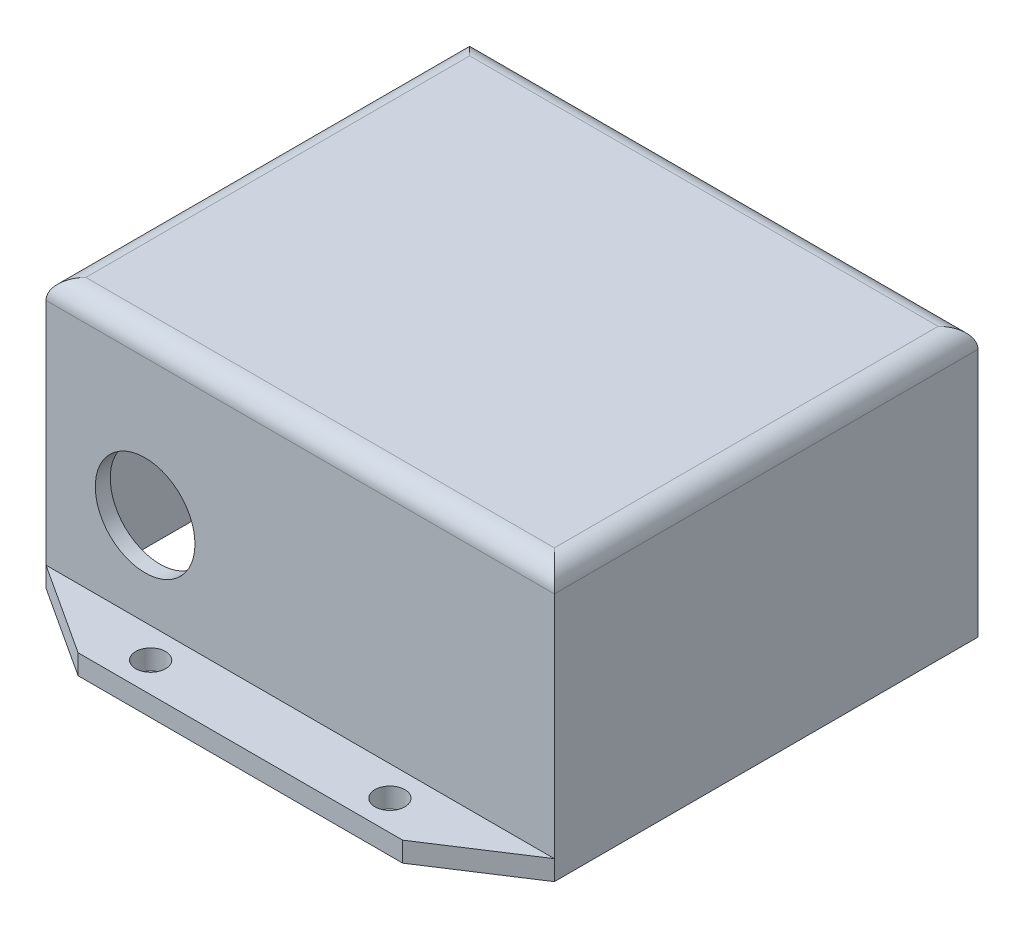
ISO-10303-21;
HEADER;
FILE_DESCRIPTION(('STEP AP214'),'2;1');
FILE_NAME('part.step','',(''),(''),'','','');
FILE_SCHEMA(('AUTOMOTIVE_DESIGN { 1 0 10303 214 1 1 1 1 }'));
ENDSEC;
DATA;
#1=APPLICATION_CONTEXT('core data for automotive mechanical design processes');
#2=APPLICATION_PROTOCOL_DEFINITION('international standard','automotive_design',2000,#1);
#3=PRODUCT_CONTEXT('',#1,'mechanical');
#4=PRODUCT('Part','Part','',(#3));
#5=PRODUCT_RELATED_PRODUCT_CATEGORY('part','',(#4));
#6=PRODUCT_DEFINITION_FORMATION('','',#4);
#7=PRODUCT_DEFINITION_CONTEXT('part definition',#1,'design');
#8=PRODUCT_DEFINITION('design','',#6,#7);
#9=PRODUCT_DEFINITION_SHAPE('','',#8);
#10=(LENGTH_UNIT() NAMED_UNIT(*) SI_UNIT(.MILLI.,.METRE.));
#11=(NAMED_UNIT(*) PLANE_ANGLE_UNIT() SI_UNIT($,.RADIAN.));
#12=(NAMED_UNIT(*) SI_UNIT($,.STERADIAN.) SOLID_ANGLE_UNIT());
#13=UNCERTAINTY_MEASURE_WITH_UNIT(LENGTH_MEASURE(1.E-05),#10,'distance_accuracy_value','');
#14=(GEOMETRIC_REPRESENTATION_CONTEXT(3) GLOBAL_UNCERTAINTY_ASSIGNED_CONTEXT((#13)) GLOBAL_UNIT_ASSIGNED_CONTEXT((#10,
#11,#12)) REPRESENTATION_CONTEXT('',''));
#15=CARTESIAN_POINT('',(0.,0.,0.));
#16=DIRECTION('',(0.,0.,1.));
#17=DIRECTION('',(1.,0.,0.));
#18=AXIS2_PLACEMENT_3D('',#15,#16,#17);
#19=CARTESIAN_POINT('',(0.,4.,0.));
#20=DIRECTION('',(0.,1.,0.));
#21=DIRECTION('',(0.,0.,1.));
#22=AXIS2_PLACEMENT_3D('',#19,#20,#21);
#23=PLANE('',#22);
#24=DIRECTION('',(1.,0.,0.));
#25=VECTOR('',#24,1.);
#26=CARTESIAN_POINT('',(-51.,4.,42.5000000000001));
#27=LINE('',#26,#25);
#28=CARTESIAN_POINT('',(-51.,4.,42.5));
#29=VERTEX_POINT('',#28);
#30=CARTESIAN_POINT('',(51.,4.,42.5));
#31=VERTEX_POINT('',#30);
#32=EDGE_CURVE('E197',#29,#31,#27,.T.);
#33=ORIENTED_EDGE('',*,*,#32,.F.);
#34=DIRECTION('',(0.838140405208444,0.,0.545454545454545));
#35=VECTOR('',#34,1.);
#36=CARTESIAN_POINT('',(-51.,4.,42.5));
#37=LINE('',#36,#35);
#38=CARTESIAN_POINT('',(-32.5609110854142,4.,54.5));
#39=VERTEX_POINT('',#38);
#40=EDGE_CURVE('E236',#29,#39,#37,.T.);
#41=ORIENTED_EDGE('',*,*,#40,.T.);
#42=DIRECTION('',(1.,0.,0.));
#43=VECTOR('',#42,1.);
#44=CARTESIAN_POINT('',(-32.5609110854142,4.,54.5));
#45=LINE('',#44,#43);
#46=CARTESIAN_POINT('',(32.5609110854143,4.,54.5));
#47=VERTEX_POINT('',#46);
#48=EDGE_CURVE('E239',#39,#47,#45,.T.);
#49=ORIENTED_EDGE('',*,*,#48,.T.);
#50=DIRECTION('',(0.838140405208444,0.,-0.545454545454545));
#51=VECTOR('',#50,1.);
#52=CARTESIAN_POINT('',(51.,4.,42.5));
#53=LINE('',#52,#51);
#54=EDGE_CURVE('E241',#47,#31,#53,.T.);
#55=ORIENTED_EDGE('',*,*,#54,.T.);
#56=EDGE_LOOP('',(#33,#41,#49,#55));
#57=FACE_BOUND('',#56,.T.);
#58=CARTESIAN_POINT('',(-24.,4.,48.5));
#59=DIRECTION('',(0.,1.,0.));
#60=DIRECTION('',(0.,0.,1.));
#61=AXIS2_PLACEMENT_3D('',#58,#59,#60);
#62=CIRCLE('',#61,3.);
#63=CARTESIAN_POINT('',(-24.,4.,51.5));
#64=VERTEX_POINT('',#63);
#65=EDGE_CURVE('E209',#64,#64,#62,.T.);
#66=ORIENTED_EDGE('',*,*,#65,.F.);
#67=EDGE_LOOP('',(#66));
#68=FACE_BOUND('',#67,.T.);
#69=CARTESIAN_POINT('',(24.,4.,48.5));
#70=DIRECTION('',(0.,1.,0.));
#71=DIRECTION('',(0.,0.,1.));
#72=AXIS2_PLACEMENT_3D('',#69,#70,#71);
#73=CIRCLE('',#72,3.);
#74=CARTESIAN_POINT('',(24.,4.,51.5));
#75=VERTEX_POINT('',#74);
#76=EDGE_CURVE('E215',#75,#75,#73,.T.);
#77=ORIENTED_EDGE('',*,*,#76,.F.);
#78=EDGE_LOOP('',(#77));
#79=FACE_BOUND('',#78,.T.);
#80=ADVANCED_FACE('F35',(#57,#68,#79),#23,.T.);
#81=DIRECTION('',(-1.,0.,0.));
#82=VECTOR('',#81,1.);
#83=CARTESIAN_POINT('',(-51.,4.,-42.5));
#84=LINE('',#83,#82);
#85=CARTESIAN_POINT('',(51.,4.,-42.5));
#86=VERTEX_POINT('',#85);
#87=CARTESIAN_POINT('',(-51.,4.,-42.5));
#88=VERTEX_POINT('',#87);
#89=EDGE_CURVE('E191',#86,#88,#84,.T.);
#90=ORIENTED_EDGE('',*,*,#89,.F.);
#91=DIRECTION('',(-0.838140405208444,0.,-0.545454545454545));
#92=VECTOR('',#91,1.);
#93=CARTESIAN_POINT('',(51.,4.,-42.5));
#94=LINE('',#93,#92);
#95=CARTESIAN_POINT('',(32.5609110854143,4.,-54.5));
#96=VERTEX_POINT('',#95);
#97=EDGE_CURVE('E244',#86,#96,#94,.T.);
#98=ORIENTED_EDGE('',*,*,#97,.T.);
#99=DIRECTION('',(-1.,0.,0.));
#100=VECTOR('',#99,1.);
#101=CARTESIAN_POINT('',(-32.5609110854142,4.,-54.5));
#102=LINE('',#101,#100);
#103=CARTESIAN_POINT('',(-32.5609110854142,4.,-54.5));
#104=VERTEX_POINT('',#103);
#105=EDGE_CURVE('E246',#96,#104,#102,.T.);
#106=ORIENTED_EDGE('',*,*,#105,.T.);
#107=DIRECTION('',(-0.838140405208444,0.,0.545454545454545));
#108=VECTOR('',#107,1.);
#109=CARTESIAN_POINT('',(-51.,4.,-42.5));
#110=LINE('',#109,#108);
#111=EDGE_CURVE('E233',#104,#88,#110,.T.);
#112=ORIENTED_EDGE('',*,*,#111,.T.);
#113=EDGE_LOOP('',(#90,#98,#106,#112));
#114=FACE_BOUND('',#113,.T.);
#115=CARTESIAN_POINT('',(-24.,4.,-48.5));
#116=DIRECTION('',(0.,1.,0.));
#117=DIRECTION('',(0.,0.,1.));
#118=AXIS2_PLACEMENT_3D('',#115,#116,#117);
#119=CIRCLE('',#118,3.);
#120=CARTESIAN_POINT('',(-24.,4.,-45.5));
#121=VERTEX_POINT('',#120);
#122=EDGE_CURVE('E227',#121,#121,#119,.T.);
#123=ORIENTED_EDGE('',*,*,#122,.F.);
#124=EDGE_LOOP('',(#123));
#125=FACE_BOUND('',#124,.T.);
#126=CARTESIAN_POINT('',(24.,4.,-48.5));
#127=DIRECTION('',(0.,1.,0.));
#128=DIRECTION('',(0.,0.,1.));
#129=AXIS2_PLACEMENT_3D('',#126,#127,#128);
#130=CIRCLE('',#129,3.);
#131=CARTESIAN_POINT('',(24.,4.,-45.5));
#132=VERTEX_POINT('',#131);
#133=EDGE_CURVE('E221',#132,#132,#130,.T.);
#134=ORIENTED_EDGE('',*,*,#133,.F.);
#135=EDGE_LOOP('',(#134));
#136=FACE_BOUND('',#135,.T.);
#137=ADVANCED_FACE('F346',(#114,#125,#136),#23,.T.);
#138=CARTESIAN_POINT('',(0.,0.,0.));
#139=DIRECTION('',(0.,1.,0.));
#140=DIRECTION('',(0.,0.,1.));
#141=AXIS2_PLACEMENT_3D('',#138,#139,#140);
#142=PLANE('',#141);
#143=DIRECTION('',(-1.,0.,0.));
#144=VECTOR('',#143,1.);
#145=CARTESIAN_POINT('',(-47.9999999999999,0.,39.5));
#146=LINE('',#145,#144);
#147=CARTESIAN_POINT('',(48.,0.,39.5));
#148=VERTEX_POINT('',#147);
#149=CARTESIAN_POINT('',(-47.9999999999999,0.,39.5));
#150=VERTEX_POINT('',#149);
#151=EDGE_CURVE('E185',#148,#150,#146,.T.);
#152=ORIENTED_EDGE('',*,*,#151,.F.);
#153=DIRECTION('',(0.,0.,1.));
#154=VECTOR('',#153,1.);
#155=CARTESIAN_POINT('',(48.,0.,-39.5));
#156=LINE('',#155,#154);
#157=CARTESIAN_POINT('',(48.,0.,-39.5));
#158=VERTEX_POINT('',#157);
#159=EDGE_CURVE('E156',#158,#148,#156,.T.);
#160=ORIENTED_EDGE('',*,*,#159,.F.);
#161=DIRECTION('',(1.,0.,0.));
#162=VECTOR('',#161,1.);
#163=CARTESIAN_POINT('',(-47.9999999999999,0.,-39.5));
#164=LINE('',#163,#162);
#165=CARTESIAN_POINT('',(-47.9999999999999,0.,-39.5));
#166=VERTEX_POINT('',#165);
#167=EDGE_CURVE('E173',#166,#158,#164,.T.);
#168=ORIENTED_EDGE('',*,*,#167,.F.);
#169=DIRECTION('',(0.,0.,-1.));
#170=VECTOR('',#169,1.);
#171=CARTESIAN_POINT('',(-47.9999999999999,0.,-39.5));
#172=LINE('',#171,#170);
#173=EDGE_CURVE('E176',#150,#166,#172,.T.);
#174=ORIENTED_EDGE('',*,*,#173,.F.);
#175=EDGE_LOOP('',(#152,#160,#168,#174));
#176=FACE_BOUND('',#175,.T.);
#177=CARTESIAN_POINT('',(24.,0.,48.5));
#178=DIRECTION('',(0.,1.,0.));
#179=DIRECTION('',(0.,0.,1.));
#180=AXIS2_PLACEMENT_3D('',#177,#178,#179);
#181=CIRCLE('',#180,3.);
#182=CARTESIAN_POINT('',(24.,0.,51.5));
#183=VERTEX_POINT('',#182);
#184=EDGE_CURVE('E212',#183,#183,#181,.T.);
#185=ORIENTED_EDGE('',*,*,#184,.T.);
#186=EDGE_LOOP('',(#185));
#187=FACE_BOUND('',#186,.T.);
#188=CARTESIAN_POINT('',(-24.,0.,-48.5));
#189=DIRECTION('',(0.,1.,0.));
#190=DIRECTION('',(0.,0.,1.));
#191=AXIS2_PLACEMENT_3D('',#188,#189,#190);
#192=CIRCLE('',#191,3.);
#193=CARTESIAN_POINT('',(-24.,0.,-45.5));
#194=VERTEX_POINT('',#193);
#195=EDGE_CURVE('E224',#194,#194,#192,.T.);
#196=ORIENTED_EDGE('',*,*,#195,.T.);
#197=EDGE_LOOP('',(#196));
#198=FACE_BOUND('',#197,.T.);
#199=DIRECTION('',(-0.838140405208444,0.,0.545454545454545));
#200=VECTOR('',#199,1.);
#201=CARTESIAN_POINT('',(-51.,0.,-42.5));
#202=LINE('',#201,#200);
#203=CARTESIAN_POINT('',(-32.5609110854142,0.,-54.5));
#204=VERTEX_POINT('',#203);
#205=CARTESIAN_POINT('',(-51.,0.,-42.5));
#206=VERTEX_POINT('',#205);
#207=EDGE_CURVE('E230',#204,#206,#202,.T.);
#208=ORIENTED_EDGE('',*,*,#207,.F.);
#209=DIRECTION('',(-1.,0.,0.));
#210=VECTOR('',#209,1.);
#211=CARTESIAN_POINT('',(-32.5609110854142,0.,-54.5));
#212=LINE('',#211,#210);
#213=CARTESIAN_POINT('',(32.5609110854143,0.,-54.5));
#214=VERTEX_POINT('',#213);
#215=EDGE_CURVE('E237',#214,#204,#212,.T.);
#216=ORIENTED_EDGE('',*,*,#215,.F.);
#217=DIRECTION('',(-0.838140405208444,0.,-0.545454545454545));
#218=VECTOR('',#217,1.);
#219=CARTESIAN_POINT('',(51.,0.,-42.5));
#220=LINE('',#219,#218);
#221=CARTESIAN_POINT('',(51.,0.,-42.5));
#222=VERTEX_POINT('',#221);
#223=EDGE_CURVE('E261',#222,#214,#220,.T.);
#224=ORIENTED_EDGE('',*,*,#223,.F.);
#225=DIRECTION('',(0.,0.,-1.));
#226=VECTOR('',#225,1.);
#227=CARTESIAN_POINT('',(51.,0.,42.5));
#228=LINE('',#227,#226);
#229=CARTESIAN_POINT('',(51.,0.,42.5));
#230=VERTEX_POINT('',#229);
#231=EDGE_CURVE('E259',#230,#222,#228,.T.);
#232=ORIENTED_EDGE('',*,*,#231,.F.);
#233=DIRECTION('',(0.838140405208444,0.,-0.545454545454545));
#234=VECTOR('',#233,1.);
#235=CARTESIAN_POINT('',(51.,0.,42.5));
#236=LINE('',#235,#234);
#237=CARTESIAN_POINT('',(32.5609110854143,0.,54.5));
#238=VERTEX_POINT('',#237);
#239=EDGE_CURVE('E257',#238,#230,#236,.T.);
#240=ORIENTED_EDGE('',*,*,#239,.F.);
#241=DIRECTION('',(1.,0.,0.));
#242=VECTOR('',#241,1.);
#243=CARTESIAN_POINT('',(-32.5609110854142,0.,54.5));
#244=LINE('',#243,#242);
#245=CARTESIAN_POINT('',(-32.5609110854142,0.,54.5));
#246=VERTEX_POINT('',#245);
#247=EDGE_CURVE('E255',#246,#238,#244,.T.);
#248=ORIENTED_EDGE('',*,*,#247,.F.);
#249=DIRECTION('',(0.838140405208444,0.,0.545454545454545));
#250=VECTOR('',#249,1.);
#251=CARTESIAN_POINT('',(-51.,0.,42.5));
#252=LINE('',#251,#250);
#253=CARTESIAN_POINT('',(-51.,0.,42.5));
#254=VERTEX_POINT('',#253);
#255=EDGE_CURVE('E253',#254,#246,#252,.T.);
#256=ORIENTED_EDGE('',*,*,#255,.F.);
#257=DIRECTION('',(0.,0.,1.));
#258=VECTOR('',#257,1.);
#259=CARTESIAN_POINT('',(-51.,0.,42.5));
#260=LINE('',#259,#258);
#261=EDGE_CURVE('E251',#206,#254,#260,.T.);
#262=ORIENTED_EDGE('',*,*,#261,.F.);
#263=EDGE_LOOP('',(#208,#216,#224,#232,#240,#248,#256,#262));
#264=FACE_BOUND('',#263,.T.);
#265=CARTESIAN_POINT('',(24.,0.,-48.5));
#266=DIRECTION('',(0.,1.,0.));
#267=DIRECTION('',(0.,0.,1.));
#268=AXIS2_PLACEMENT_3D('',#265,#266,#267);
#269=CIRCLE('',#268,3.);
#270=CARTESIAN_POINT('',(24.,0.,-45.5));
#271=VERTEX_POINT('',#270);
#272=EDGE_CURVE('E218',#271,#271,#269,.T.);
#273=ORIENTED_EDGE('',*,*,#272,.T.);
#274=EDGE_LOOP('',(#273));
#275=FACE_BOUND('',#274,.T.);
#276=CARTESIAN_POINT('',(-24.,0.,48.5));
#277=DIRECTION('',(0.,1.,0.));
#278=DIRECTION('',(0.,0.,1.));
#279=AXIS2_PLACEMENT_3D('',#276,#277,#278);
#280=CIRCLE('',#279,3.);
#281=CARTESIAN_POINT('',(-24.,0.,51.5));
#282=VERTEX_POINT('',#281);
#283=EDGE_CURVE('E208',#282,#282,#280,.T.);
#284=ORIENTED_EDGE('',*,*,#283,.T.);
#285=EDGE_LOOP('',(#284));
#286=FACE_BOUND('',#285,.T.);
#287=ADVANCED_FACE('F352',(#176,#187,#198,#264,#275,#286),#142,.F.);
#288=CARTESIAN_POINT('',(-51.,4.,-42.5));
#289=DIRECTION('',(0.545454545454546,0.,0.838140405208444));
#290=DIRECTION('',(0.838140405208444,0.,-0.545454545454546));
#291=AXIS2_PLACEMENT_3D('',#288,#289,#290);
#292=PLANE('',#291);
#293=ORIENTED_EDGE('',*,*,#207,.T.);
#294=DIRECTION('',(0.,-1.,0.));
#295=VECTOR('',#294,1.);
#296=CARTESIAN_POINT('',(-51.,4.,-42.5));
#297=LINE('',#296,#295);
#298=EDGE_CURVE('E284',#88,#206,#297,.T.);
#299=ORIENTED_EDGE('',*,*,#298,.F.);
#300=ORIENTED_EDGE('',*,*,#111,.F.);
#301=DIRECTION('',(0.,-1.,0.));
#302=VECTOR('',#301,1.);
#303=CARTESIAN_POINT('',(-32.5609110854142,4.,-54.5));
#304=LINE('',#303,#302);
#305=EDGE_CURVE('E248',#104,#204,#304,.T.);
#306=ORIENTED_EDGE('',*,*,#305,.T.);
#307=EDGE_LOOP('',(#293,#299,#300,#306));
#308=FACE_BOUND('',#307,.T.);
#309=ADVANCED_FACE('F362',(#308),#292,.F.);
#310=CARTESIAN_POINT('',(-51.,4.,42.5));
#311=DIRECTION('',(1.,0.,0.));
#312=DIRECTION('',(0.,0.,-1.));
#313=AXIS2_PLACEMENT_3D('',#310,#311,#312);
#314=PLANE('',#313);
#315=DIRECTION('',(0.,-1.,0.));
#316=VECTOR('',#315,1.);
#317=CARTESIAN_POINT('',(-51.,54.,42.5000000000001));
#318=LINE('',#317,#316);
#319=CARTESIAN_POINT('',(-51.,50.,42.5000000000001));
#320=VERTEX_POINT('',#319);
#321=EDGE_CURVE('E202',#320,#29,#318,.T.);
#322=ORIENTED_EDGE('',*,*,#321,.F.);
#323=DIRECTION('',(0.,0.,1.));
#324=VECTOR('',#323,1.);
#325=CARTESIAN_POINT('',(-51.,50.,42.5));
#326=LINE('',#325,#324);
#327=CARTESIAN_POINT('',(-51.,50.,-42.5));
#328=VERTEX_POINT('',#327);
#329=EDGE_CURVE('E11',#320,#328,#326,.F.);
#330=ORIENTED_EDGE('',*,*,#329,.T.);
#331=DIRECTION('',(0.,-1.,0.));
#332=VECTOR('',#331,1.);
#333=CARTESIAN_POINT('',(-51.,54.,-42.5));
#334=LINE('',#333,#332);
#335=EDGE_CURVE('E204',#328,#88,#334,.T.);
#336=ORIENTED_EDGE('',*,*,#335,.T.);
#337=ORIENTED_EDGE('',*,*,#298,.T.);
#338=ORIENTED_EDGE('',*,*,#261,.T.);
#339=DIRECTION('',(0.,-1.,0.));
#340=VECTOR('',#339,1.);
#341=CARTESIAN_POINT('',(-51.,4.,42.5));
#342=LINE('',#341,#340);
#343=EDGE_CURVE('E281',#29,#254,#342,.T.);
#344=ORIENTED_EDGE('',*,*,#343,.F.);
#345=EDGE_LOOP('',(#322,#330,#336,#337,#338,#344));
#346=FACE_BOUND('',#345,.T.);
#347=ADVANCED_FACE('F322',(#346),#314,.F.);
#348=CARTESIAN_POINT('',(-51.,4.,42.5));
#349=DIRECTION('',(0.545454545454546,0.,-0.838140405208444));
#350=DIRECTION('',(-0.838140405208444,0.,-0.545454545454546));
#351=AXIS2_PLACEMENT_3D('',#348,#349,#350);
#352=PLANE('',#351);
#353=ORIENTED_EDGE('',*,*,#255,.T.);
#354=DIRECTION('',(0.,-1.,0.));
#355=VECTOR('',#354,1.);
#356=CARTESIAN_POINT('',(-32.5609110854142,4.,54.5));
#357=LINE('',#356,#355);
#358=EDGE_CURVE('E278',#39,#246,#357,.T.);
#359=ORIENTED_EDGE('',*,*,#358,.F.);
#360=ORIENTED_EDGE('',*,*,#40,.F.);
#361=ORIENTED_EDGE('',*,*,#343,.T.);
#362=EDGE_LOOP('',(#353,#359,#360,#361));
#363=FACE_BOUND('',#362,.T.);
#364=ADVANCED_FACE('F382',(#363),#352,.F.);
#365=CARTESIAN_POINT('',(-32.5609110854142,4.,54.5));
#366=DIRECTION('',(0.,0.,-1.));
#367=DIRECTION('',(-1.,0.,0.));
#368=AXIS2_PLACEMENT_3D('',#365,#366,#367);
#369=PLANE('',#368);
#370=ORIENTED_EDGE('',*,*,#247,.T.);
#371=DIRECTION('',(0.,-1.,0.));
#372=VECTOR('',#371,1.);
#373=CARTESIAN_POINT('',(32.5609110854143,4.,54.5));
#374=LINE('',#373,#372);
#375=EDGE_CURVE('E275',#47,#238,#374,.T.);
#376=ORIENTED_EDGE('',*,*,#375,.F.);
#377=ORIENTED_EDGE('',*,*,#48,.F.);
#378=ORIENTED_EDGE('',*,*,#358,.T.);
#379=EDGE_LOOP('',(#370,#376,#377,#378));
#380=FACE_BOUND('',#379,.T.);
#381=ADVANCED_FACE('F378',(#380),#369,.F.);
#382=CARTESIAN_POINT('',(51.,4.,42.5));
#383=DIRECTION('',(-0.545454545454546,0.,-0.838140405208444));
#384=DIRECTION('',(-0.838140405208444,0.,0.545454545454546));
#385=AXIS2_PLACEMENT_3D('',#382,#383,#384);
#386=PLANE('',#385);
#387=ORIENTED_EDGE('',*,*,#239,.T.);
#388=DIRECTION('',(0.,-1.,0.));
#389=VECTOR('',#388,1.);
#390=CARTESIAN_POINT('',(51.,4.,42.5));
#391=LINE('',#390,#389);
#392=EDGE_CURVE('E272',#31,#230,#391,.T.);
#393=ORIENTED_EDGE('',*,*,#392,.F.);
#394=ORIENTED_EDGE('',*,*,#54,.F.);
#395=ORIENTED_EDGE('',*,*,#375,.T.);
#396=EDGE_LOOP('',(#387,#393,#394,#395));
#397=FACE_BOUND('',#396,.T.);
#398=ADVANCED_FACE('F375',(#397),#386,.F.);
#399=CARTESIAN_POINT('',(51.,4.,42.5));
#400=DIRECTION('',(-1.,0.,0.));
#401=DIRECTION('',(0.,0.,1.));
#402=AXIS2_PLACEMENT_3D('',#399,#400,#401);
#403=PLANE('',#402);
#404=DIRECTION('',(0.,-1.,0.));
#405=VECTOR('',#404,1.);
#406=CARTESIAN_POINT('',(51.,54.,-42.5));
#407=LINE('',#406,#405);
#408=CARTESIAN_POINT('',(51.,50.,-42.5));
#409=VERTEX_POINT('',#408);
#410=EDGE_CURVE('E206',#409,#86,#407,.T.);
#411=ORIENTED_EDGE('',*,*,#410,.F.);
#412=DIRECTION('',(0.,0.,-1.));
#413=VECTOR('',#412,1.);
#414=CARTESIAN_POINT('',(51.,50.,42.5));
#415=LINE('',#414,#413);
#416=CARTESIAN_POINT('',(51.,50.,42.5));
#417=VERTEX_POINT('',#416);
#418=EDGE_CURVE('E59',#409,#417,#415,.F.);
#419=ORIENTED_EDGE('',*,*,#418,.T.);
#420=DIRECTION('',(0.,-1.,0.));
#421=VECTOR('',#420,1.);
#422=CARTESIAN_POINT('',(51.,54.,42.5));
#423=LINE('',#422,#421);
#424=EDGE_CURVE('E200',#417,#31,#423,.T.);
#425=ORIENTED_EDGE('',*,*,#424,.T.);
#426=ORIENTED_EDGE('',*,*,#392,.T.);
#427=ORIENTED_EDGE('',*,*,#231,.T.);
#428=DIRECTION('',(0.,-1.,0.));
#429=VECTOR('',#428,1.);
#430=CARTESIAN_POINT('',(51.,4.,-42.5));
#431=LINE('',#430,#429);
#432=EDGE_CURVE('E269',#86,#222,#431,.T.);
#433=ORIENTED_EDGE('',*,*,#432,.F.);
#434=EDGE_LOOP('',(#411,#419,#425,#426,#427,#433));
#435=FACE_BOUND('',#434,.T.);
#436=ADVANCED_FACE('F371',(#435),#403,.F.);
#437=CARTESIAN_POINT('',(51.,4.,-42.5));
#438=DIRECTION('',(-0.545454545454546,0.,0.838140405208444));
#439=DIRECTION('',(0.838140405208444,0.,0.545454545454546));
#440=AXIS2_PLACEMENT_3D('',#437,#438,#439);
#441=PLANE('',#440);
#442=ORIENTED_EDGE('',*,*,#223,.T.);
#443=DIRECTION('',(0.,-1.,0.));
#444=VECTOR('',#443,1.);
#445=CARTESIAN_POINT('',(32.5609110854143,4.,-54.5));
#446=LINE('',#445,#444);
#447=EDGE_CURVE('E266',#96,#214,#446,.T.);
#448=ORIENTED_EDGE('',*,*,#447,.F.);
#449=ORIENTED_EDGE('',*,*,#97,.F.);
#450=ORIENTED_EDGE('',*,*,#432,.T.);
#451=EDGE_LOOP('',(#442,#448,#449,#450));
#452=FACE_BOUND('',#451,.T.);
#453=ADVANCED_FACE('F367',(#452),#441,.F.);
#454=CARTESIAN_POINT('',(-32.5609110854142,4.,-54.5));
#455=DIRECTION('',(0.,0.,1.));
#456=DIRECTION('',(1.,0.,0.));
#457=AXIS2_PLACEMENT_3D('',#454,#455,#456);
#458=PLANE('',#457);
#459=ORIENTED_EDGE('',*,*,#215,.T.);
#460=ORIENTED_EDGE('',*,*,#305,.F.);
#461=ORIENTED_EDGE('',*,*,#105,.F.);
#462=ORIENTED_EDGE('',*,*,#447,.T.);
#463=EDGE_LOOP('',(#459,#460,#461,#462));
#464=FACE_BOUND('',#463,.T.);
#465=ADVANCED_FACE('F364',(#464),#458,.F.);
#466=CARTESIAN_POINT('',(-24.,4.,-48.5));
#467=DIRECTION('',(0.,-1.,0.));
#468=DIRECTION('',(0.,0.,-1.));
#469=AXIS2_PLACEMENT_3D('',#466,#467,#468);
#470=CYLINDRICAL_SURFACE('',#469,3.);
#471=ORIENTED_EDGE('',*,*,#122,.T.);
#472=EDGE_LOOP('',(#471));
#473=FACE_BOUND('',#472,.T.);
#474=ORIENTED_EDGE('',*,*,#195,.F.);
#475=EDGE_LOOP('',(#474));
#476=FACE_BOUND('',#475,.T.);
#477=ADVANCED_FACE('F358',(#473,#476),#470,.F.);
#478=CARTESIAN_POINT('',(24.,4.,-48.5));
#479=DIRECTION('',(0.,-1.,0.));
#480=DIRECTION('',(0.,0.,-1.));
#481=AXIS2_PLACEMENT_3D('',#478,#479,#480);
#482=CYLINDRICAL_SURFACE('',#481,3.);
#483=ORIENTED_EDGE('',*,*,#133,.T.);
#484=EDGE_LOOP('',(#483));
#485=FACE_BOUND('',#484,.T.);
#486=ORIENTED_EDGE('',*,*,#272,.F.);
#487=EDGE_LOOP('',(#486));
#488=FACE_BOUND('',#487,.T.);
#489=ADVANCED_FACE('F443',(#485,#488),#482,.F.);
#490=CARTESIAN_POINT('',(24.,4.,48.5));
#491=DIRECTION('',(0.,-1.,0.));
#492=DIRECTION('',(0.,0.,-1.));
#493=AXIS2_PLACEMENT_3D('',#490,#491,#492);
#494=CYLINDRICAL_SURFACE('',#493,3.);
#495=ORIENTED_EDGE('',*,*,#76,.T.);
#496=EDGE_LOOP('',(#495));
#497=FACE_BOUND('',#496,.T.);
#498=ORIENTED_EDGE('',*,*,#184,.F.);
#499=EDGE_LOOP('',(#498));
#500=FACE_BOUND('',#499,.T.);
#501=ADVANCED_FACE('F435',(#497,#500),#494,.F.);
#502=CARTESIAN_POINT('',(-24.,4.,48.5));
#503=DIRECTION('',(0.,-1.,0.));
#504=DIRECTION('',(0.,0.,-1.));
#505=AXIS2_PLACEMENT_3D('',#502,#503,#504);
#506=CYLINDRICAL_SURFACE('',#505,3.);
#507=ORIENTED_EDGE('',*,*,#65,.T.);
#508=EDGE_LOOP('',(#507));
#509=FACE_BOUND('',#508,.T.);
#510=ORIENTED_EDGE('',*,*,#283,.F.);
#511=EDGE_LOOP('',(#510));
#512=FACE_BOUND('',#511,.T.);
#513=ADVANCED_FACE('F433',(#509,#512),#506,.F.);
#514=CARTESIAN_POINT('',(-51.,54.,-42.5));
#515=DIRECTION('',(0.,0.,1.));
#516=DIRECTION('',(1.,0.,0.));
#517=AXIS2_PLACEMENT_3D('',#514,#515,#516);
#518=PLANE('',#517);
#519=ORIENTED_EDGE('',*,*,#335,.F.);
#520=DIRECTION('',(-1.,0.,0.));
#521=VECTOR('',#520,1.);
#522=CARTESIAN_POINT('',(-51.,50.,-42.5));
#523=LINE('',#522,#521);
#524=EDGE_CURVE('E296',#328,#409,#523,.F.);
#525=ORIENTED_EDGE('',*,*,#524,.T.);
#526=ORIENTED_EDGE('',*,*,#410,.T.);
#527=ORIENTED_EDGE('',*,*,#89,.T.);
#528=EDGE_LOOP('',(#519,#525,#526,#527));
#529=FACE_BOUND('',#528,.T.);
#530=ADVANCED_FACE('F327',(#529),#518,.F.);
#531=CARTESIAN_POINT('',(-51.,54.,42.5000000000001));
#532=DIRECTION('',(0.,0.,-1.));
#533=DIRECTION('',(-1.,0.,0.));
#534=AXIS2_PLACEMENT_3D('',#531,#532,#533);
#535=PLANE('',#534);
#536=CARTESIAN_POINT('',(-31.1112357466499,22.5989241998121,42.5));
#537=DIRECTION('',(0.,0.,1.));
#538=DIRECTION('',(1.,0.,0.));
#539=AXIS2_PLACEMENT_3D('',#536,#537,#538);
#540=CIRCLE('',#539,10.);
#541=CARTESIAN_POINT('',(-21.1112357466498,22.5989241998121,42.5));
#542=VERTEX_POINT('',#541);
#543=EDGE_CURVE('E179',#542,#542,#540,.T.);
#544=ORIENTED_EDGE('',*,*,#543,.F.);
#545=EDGE_LOOP('',(#544));
#546=FACE_BOUND('',#545,.T.);
#547=ORIENTED_EDGE('',*,*,#424,.F.);
#548=DIRECTION('',(1.,0.,0.));
#549=VECTOR('',#548,1.);
#550=CARTESIAN_POINT('',(-51.,50.,42.5000000000001));
#551=LINE('',#550,#549);
#552=EDGE_CURVE('E44',#417,#320,#551,.F.);
#553=ORIENTED_EDGE('',*,*,#552,.T.);
#554=ORIENTED_EDGE('',*,*,#321,.T.);
#555=ORIENTED_EDGE('',*,*,#32,.T.);
#556=EDGE_LOOP('',(#547,#553,#554,#555));
#557=FACE_BOUND('',#556,.T.);
#558=ADVANCED_FACE('F335',(#546,#557),#535,.F.);
#559=CARTESIAN_POINT('',(0.,54.,0.));
#560=DIRECTION('',(0.,-1.,0.));
#561=DIRECTION('',(0.,0.,-1.));
#562=AXIS2_PLACEMENT_3D('',#559,#560,#561);
#563=PLANE('',#562);
#564=DIRECTION('',(0.,0.,-1.));
#565=VECTOR('',#564,1.);
#566=CARTESIAN_POINT('',(47.,54.,0.));
#567=LINE('',#566,#565);
#568=CARTESIAN_POINT('',(47.,54.,38.5));
#569=VERTEX_POINT('',#568);
#570=CARTESIAN_POINT('',(47.,54.,-38.5));
#571=VERTEX_POINT('',#570);
#572=EDGE_CURVE('E291',#569,#571,#567,.T.);
#573=ORIENTED_EDGE('',*,*,#572,.T.);
#574=DIRECTION('',(-1.,0.,0.));
#575=VECTOR('',#574,1.);
#576=CARTESIAN_POINT('',(0.,54.,-38.5));
#577=LINE('',#576,#575);
#578=CARTESIAN_POINT('',(-47.,54.,-38.5));
#579=VERTEX_POINT('',#578);
#580=EDGE_CURVE('E293',#571,#579,#577,.T.);
#581=ORIENTED_EDGE('',*,*,#580,.T.);
#582=DIRECTION('',(0.,0.,1.));
#583=VECTOR('',#582,1.);
#584=CARTESIAN_POINT('',(-47.,54.,0.));
#585=LINE('',#584,#583);
#586=CARTESIAN_POINT('',(-47.,54.,38.5000000000001));
#587=VERTEX_POINT('',#586);
#588=EDGE_CURVE('E287',#579,#587,#585,.T.);
#589=ORIENTED_EDGE('',*,*,#588,.T.);
#590=DIRECTION('',(1.,0.,0.));
#591=VECTOR('',#590,1.);
#592=CARTESIAN_POINT('',(0.,54.,38.5));
#593=LINE('',#592,#591);
#594=EDGE_CURVE('E289',#587,#569,#593,.T.);
#595=ORIENTED_EDGE('',*,*,#594,.T.);
#596=EDGE_LOOP('',(#573,#581,#589,#595));
#597=FACE_BOUND('',#596,.T.);
#598=ADVANCED_FACE('F333',(#597),#563,.F.);
#599=CARTESIAN_POINT('',(48.,50.,-39.5));
#600=DIRECTION('',(1.,0.,0.));
#601=DIRECTION('',(0.,0.,-1.));
#602=AXIS2_PLACEMENT_3D('',#599,#600,#601);
#603=PLANE('',#602);
#604=ORIENTED_EDGE('',*,*,#159,.T.);
#605=DIRECTION('',(0.,-1.,0.));
#606=VECTOR('',#605,1.);
#607=CARTESIAN_POINT('',(48.,50.,39.5));
#608=LINE('',#607,#606);
#609=CARTESIAN_POINT('',(48.,50.,39.5));
#610=VERTEX_POINT('',#609);
#611=EDGE_CURVE('E149',#610,#148,#608,.T.);
#612=ORIENTED_EDGE('',*,*,#611,.F.);
#613=DIRECTION('',(0.,0.,1.));
#614=VECTOR('',#613,1.);
#615=CARTESIAN_POINT('',(48.,50.,-39.5));
#616=LINE('',#615,#614);
#617=CARTESIAN_POINT('',(48.,50.,-39.5));
#618=VERTEX_POINT('',#617);
#619=EDGE_CURVE('E153',#618,#610,#616,.T.);
#620=ORIENTED_EDGE('',*,*,#619,.F.);
#621=DIRECTION('',(0.,-1.,0.));
#622=VECTOR('',#621,1.);
#623=CARTESIAN_POINT('',(48.,50.,-39.5));
#624=LINE('',#623,#622);
#625=EDGE_CURVE('E189',#618,#158,#624,.T.);
#626=ORIENTED_EDGE('',*,*,#625,.T.);
#627=EDGE_LOOP('',(#604,#612,#620,#626));
#628=FACE_BOUND('',#627,.T.);
#629=ADVANCED_FACE('F151',(#628),#603,.F.);
#630=CARTESIAN_POINT('',(-47.9999999999999,50.,-39.5));
#631=DIRECTION('',(0.,0.,-1.));
#632=DIRECTION('',(-1.,0.,0.));
#633=AXIS2_PLACEMENT_3D('',#630,#631,#632);
#634=PLANE('',#633);
#635=ORIENTED_EDGE('',*,*,#167,.T.);
#636=ORIENTED_EDGE('',*,*,#625,.F.);
#637=DIRECTION('',(1.,0.,0.));
#638=VECTOR('',#637,1.);
#639=CARTESIAN_POINT('',(-47.9999999999999,50.,-39.5));
#640=LINE('',#639,#638);
#641=CARTESIAN_POINT('',(-47.9999999999999,50.,-39.5));
#642=VERTEX_POINT('',#641);
#643=EDGE_CURVE('E161',#642,#618,#640,.T.);
#644=ORIENTED_EDGE('',*,*,#643,.F.);
#645=DIRECTION('',(0.,-1.,0.));
#646=VECTOR('',#645,1.);
#647=CARTESIAN_POINT('',(-47.9999999999999,50.,-39.5));
#648=LINE('',#647,#646);
#649=EDGE_CURVE('E192',#642,#166,#648,.T.);
#650=ORIENTED_EDGE('',*,*,#649,.T.);
#651=EDGE_LOOP('',(#635,#636,#644,#650));
#652=FACE_BOUND('',#651,.T.);
#653=ADVANCED_FACE('F341',(#652),#634,.F.);
#654=CARTESIAN_POINT('',(-47.9999999999999,50.,-39.5));
#655=DIRECTION('',(-1.,0.,0.));
#656=DIRECTION('',(0.,0.,1.));
#657=AXIS2_PLACEMENT_3D('',#654,#655,#656);
#658=PLANE('',#657);
#659=ORIENTED_EDGE('',*,*,#173,.T.);
#660=ORIENTED_EDGE('',*,*,#649,.F.);
#661=DIRECTION('',(0.,0.,-1.));
#662=VECTOR('',#661,1.);
#663=CARTESIAN_POINT('',(-47.9999999999999,50.,-39.5));
#664=LINE('',#663,#662);
#665=CARTESIAN_POINT('',(-47.9999999999999,50.,39.5));
#666=VERTEX_POINT('',#665);
#667=EDGE_CURVE('E169',#666,#642,#664,.T.);
#668=ORIENTED_EDGE('',*,*,#667,.F.);
#669=DIRECTION('',(0.,-1.,0.));
#670=VECTOR('',#669,1.);
#671=CARTESIAN_POINT('',(-47.9999999999999,50.,39.5));
#672=LINE('',#671,#670);
#673=EDGE_CURVE('E160',#666,#150,#672,.T.);
#674=ORIENTED_EDGE('',*,*,#673,.T.);
#675=EDGE_LOOP('',(#659,#660,#668,#674));
#676=FACE_BOUND('',#675,.T.);
#677=ADVANCED_FACE('F407',(#676),#658,.F.);
#678=CARTESIAN_POINT('',(-47.9999999999999,50.,39.5));
#679=DIRECTION('',(0.,0.,1.));
#680=DIRECTION('',(1.,0.,0.));
#681=AXIS2_PLACEMENT_3D('',#678,#679,#680);
#682=PLANE('',#681);
#683=CARTESIAN_POINT('',(-31.1112357466499,22.5989241998121,39.5));
#684=DIRECTION('',(0.,0.,1.));
#685=DIRECTION('',(1.,0.,0.));
#686=AXIS2_PLACEMENT_3D('',#683,#684,#685);
#687=CIRCLE('',#686,10.);
#688=CARTESIAN_POINT('',(-21.1112357466498,22.5989241998121,39.5));
#689=VERTEX_POINT('',#688);
#690=EDGE_CURVE('E618',#689,#689,#687,.F.);
#691=ORIENTED_EDGE('',*,*,#690,.F.);
#692=EDGE_LOOP('',(#691));
#693=FACE_BOUND('',#692,.T.);
#694=ORIENTED_EDGE('',*,*,#151,.T.);
#695=ORIENTED_EDGE('',*,*,#673,.F.);
#696=DIRECTION('',(-1.,0.,0.));
#697=VECTOR('',#696,1.);
#698=CARTESIAN_POINT('',(-47.9999999999999,50.,39.5));
#699=LINE('',#698,#697);
#700=EDGE_CURVE('E164',#610,#666,#699,.T.);
#701=ORIENTED_EDGE('',*,*,#700,.F.);
#702=ORIENTED_EDGE('',*,*,#611,.T.);
#703=EDGE_LOOP('',(#694,#695,#701,#702));
#704=FACE_BOUND('',#703,.T.);
#705=ADVANCED_FACE('F165',(#693,#704),#682,.F.);
#706=CARTESIAN_POINT('',(0.,50.,0.));
#707=DIRECTION('',(0.,1.,0.));
#708=DIRECTION('',(0.,0.,1.));
#709=AXIS2_PLACEMENT_3D('',#706,#707,#708);
#710=PLANE('',#709);
#711=ORIENTED_EDGE('',*,*,#619,.T.);
#712=ORIENTED_EDGE('',*,*,#700,.T.);
#713=ORIENTED_EDGE('',*,*,#667,.T.);
#714=ORIENTED_EDGE('',*,*,#643,.T.);
#715=EDGE_LOOP('',(#711,#712,#713,#714));
#716=FACE_BOUND('',#715,.T.);
#717=ADVANCED_FACE('F171',(#716),#710,.F.);
#718=CARTESIAN_POINT('',(0.,50.,38.5));
#719=DIRECTION('',(1.,0.,0.));
#720=DIRECTION('',(0.,0.,-1.));
#721=AXIS2_PLACEMENT_3D('',#718,#719,#720);
#722=CYLINDRICAL_SURFACE('',#721,4.);
#723=CARTESIAN_POINT('',(-47.,50.,38.5000000000001));
#724=DIRECTION('',(0.707106781186548,0.,0.707106781186547));
#725=DIRECTION('',(-0.707106781186547,0.,0.707106781186548));
#726=AXIS2_PLACEMENT_3D('',#723,#724,#725);
#727=ELLIPSE('',#726,5.65685424949238,4.);
#728=EDGE_CURVE('E304',#320,#587,#727,.F.);
#729=ORIENTED_EDGE('',*,*,#728,.F.);
#730=ORIENTED_EDGE('',*,*,#552,.F.);
#731=CARTESIAN_POINT('',(47.,50.,38.5));
#732=DIRECTION('',(0.707106781186547,0.,-0.707106781186548));
#733=DIRECTION('',(0.707106781186548,0.,0.707106781186547));
#734=AXIS2_PLACEMENT_3D('',#731,#732,#733);
#735=ELLIPSE('',#734,5.65685424949238,4.);
#736=EDGE_CURVE('E39',#569,#417,#735,.T.);
#737=ORIENTED_EDGE('',*,*,#736,.F.);
#738=ORIENTED_EDGE('',*,*,#594,.F.);
#739=EDGE_LOOP('',(#729,#730,#737,#738));
#740=FACE_BOUND('',#739,.T.);
#741=ADVANCED_FACE('F37',(#740),#722,.T.);
#742=CARTESIAN_POINT('',(47.,50.,0.));
#743=DIRECTION('',(0.,0.,-1.));
#744=DIRECTION('',(-1.,0.,0.));
#745=AXIS2_PLACEMENT_3D('',#742,#743,#744);
#746=CYLINDRICAL_SURFACE('',#745,4.);
#747=ORIENTED_EDGE('',*,*,#736,.T.);
#748=ORIENTED_EDGE('',*,*,#418,.F.);
#749=CARTESIAN_POINT('',(47.,50.,-38.5));
#750=DIRECTION('',(-0.707106781186547,0.,-0.707106781186547));
#751=DIRECTION('',(0.707106781186547,0.,-0.707106781186547));
#752=AXIS2_PLACEMENT_3D('',#749,#750,#751);
#753=ELLIPSE('',#752,5.65685424949238,4.);
#754=EDGE_CURVE('E303',#571,#409,#753,.T.);
#755=ORIENTED_EDGE('',*,*,#754,.F.);
#756=ORIENTED_EDGE('',*,*,#572,.F.);
#757=EDGE_LOOP('',(#747,#748,#755,#756));
#758=FACE_BOUND('',#757,.T.);
#759=ADVANCED_FACE('F314',(#758),#746,.T.);
#760=CARTESIAN_POINT('',(-47.,50.,0.));
#761=DIRECTION('',(0.,0.,1.));
#762=DIRECTION('',(1.,0.,0.));
#763=AXIS2_PLACEMENT_3D('',#760,#761,#762);
#764=CYLINDRICAL_SURFACE('',#763,4.);
#765=ORIENTED_EDGE('',*,*,#728,.T.);
#766=ORIENTED_EDGE('',*,*,#588,.F.);
#767=CARTESIAN_POINT('',(-47.,50.,-38.5));
#768=DIRECTION('',(-0.707106781186547,0.,0.707106781186547));
#769=DIRECTION('',(0.707106781186547,0.,0.707106781186547));
#770=AXIS2_PLACEMENT_3D('',#767,#768,#769);
#771=ELLIPSE('',#770,5.65685424949238,4.);
#772=EDGE_CURVE('E301',#328,#579,#771,.F.);
#773=ORIENTED_EDGE('',*,*,#772,.F.);
#774=ORIENTED_EDGE('',*,*,#329,.F.);
#775=EDGE_LOOP('',(#765,#766,#773,#774));
#776=FACE_BOUND('',#775,.T.);
#777=ADVANCED_FACE('F319',(#776),#764,.T.);
#778=CARTESIAN_POINT('',(0.,50.,-38.5));
#779=DIRECTION('',(-1.,0.,0.));
#780=DIRECTION('',(0.,0.,1.));
#781=AXIS2_PLACEMENT_3D('',#778,#779,#780);
#782=CYLINDRICAL_SURFACE('',#781,4.);
#783=ORIENTED_EDGE('',*,*,#754,.T.);
#784=ORIENTED_EDGE('',*,*,#524,.F.);
#785=ORIENTED_EDGE('',*,*,#772,.T.);
#786=ORIENTED_EDGE('',*,*,#580,.F.);
#787=EDGE_LOOP('',(#783,#784,#785,#786));
#788=FACE_BOUND('',#787,.T.);
#789=ADVANCED_FACE('F330',(#788),#782,.T.);
#790=CARTESIAN_POINT('',(-31.1112357466499,22.5989241998121,-54.501));
#791=DIRECTION('',(0.,0.,1.));
#792=DIRECTION('',(1.,0.,0.));
#793=AXIS2_PLACEMENT_3D('',#790,#791,#792);
#794=CYLINDRICAL_SURFACE('',#793,10.);
#795=ORIENTED_EDGE('',*,*,#543,.T.);
#796=EDGE_LOOP('',(#795));
#797=FACE_BOUND('',#796,.T.);
#798=ORIENTED_EDGE('',*,*,#690,.T.);
#799=EDGE_LOOP('',(#798));
#800=FACE_BOUND('',#799,.T.);
#801=ADVANCED_FACE('F394',(#797,#800),#794,.F.);
#802=CLOSED_SHELL('',(#80,#137,#287,#309,#347,#364,#381,#398,#436,#453,#465,#477,#489,#501,#513,
#530,#558,#598,#629,#653,#677,#705,#717,#741,#759,#777,#789,#801));
#803=MANIFOLD_SOLID_BREP('B2',#802);
#804=ADVANCED_BREP_SHAPE_REPRESENTATION('',(#18,#803),#14);
#805=SHAPE_DEFINITION_REPRESENTATION(#9,#804);
ENDSEC;
END-ISO-10303-21;
